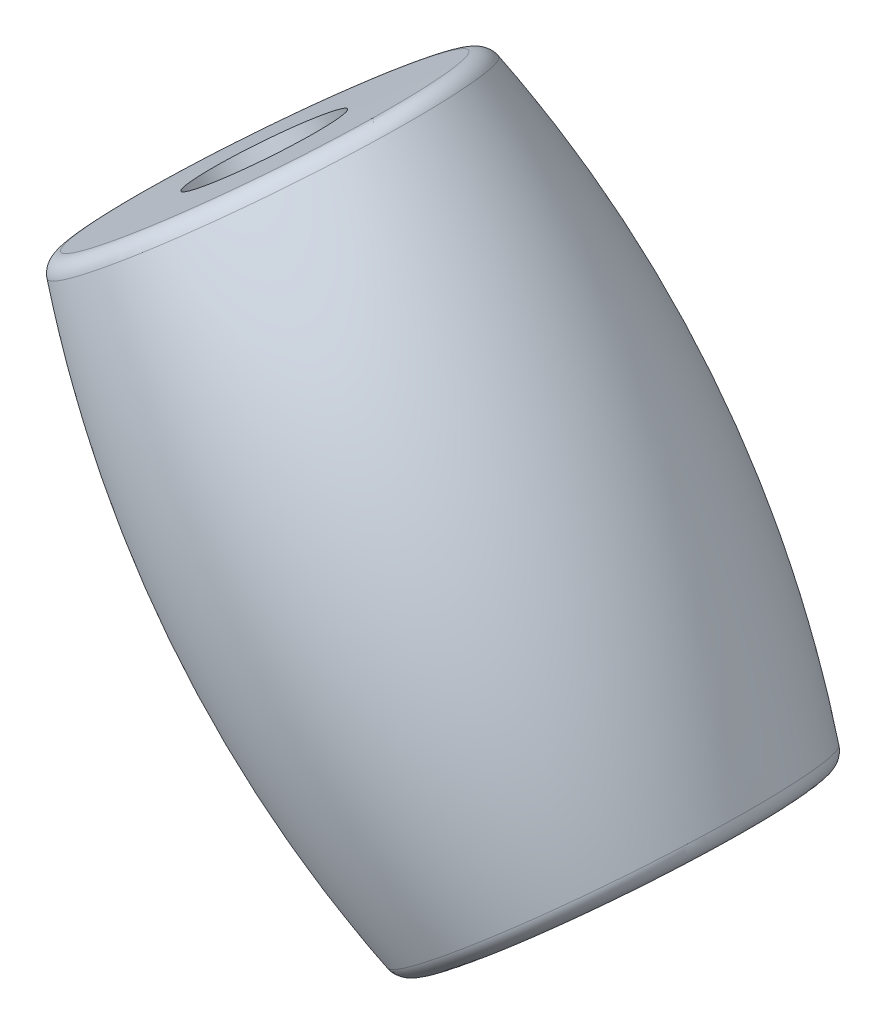
ISO-10303-21;
HEADER;
FILE_DESCRIPTION(('STEP AP214'),'2;1');
FILE_NAME('part.step','',(''),(''),'','','');
FILE_SCHEMA(('AUTOMOTIVE_DESIGN { 1 0 10303 214 1 1 1 1 }'));
ENDSEC;
DATA;
#1=APPLICATION_CONTEXT('core data for automotive mechanical design processes');
#2=APPLICATION_PROTOCOL_DEFINITION('international standard','automotive_design',2000,#1);
#3=PRODUCT_CONTEXT('',#1,'mechanical');
#4=PRODUCT('Part','Part','',(#3));
#5=PRODUCT_RELATED_PRODUCT_CATEGORY('part','',(#4));
#6=PRODUCT_DEFINITION_FORMATION('','',#4);
#7=PRODUCT_DEFINITION_CONTEXT('part definition',#1,'design');
#8=PRODUCT_DEFINITION('design','',#6,#7);
#9=PRODUCT_DEFINITION_SHAPE('','',#8);
#10=(LENGTH_UNIT() NAMED_UNIT(*) SI_UNIT(.MILLI.,.METRE.));
#11=(NAMED_UNIT(*) PLANE_ANGLE_UNIT() SI_UNIT($,.RADIAN.));
#12=(NAMED_UNIT(*) SI_UNIT($,.STERADIAN.) SOLID_ANGLE_UNIT());
#13=UNCERTAINTY_MEASURE_WITH_UNIT(LENGTH_MEASURE(1.E-05),#10,'distance_accuracy_value','');
#14=(GEOMETRIC_REPRESENTATION_CONTEXT(3) GLOBAL_UNCERTAINTY_ASSIGNED_CONTEXT((#13)) GLOBAL_UNIT_ASSIGNED_CONTEXT((#10,
#11,#12)) REPRESENTATION_CONTEXT('',''));
#15=CARTESIAN_POINT('',(0.,0.,0.));
#16=DIRECTION('',(0.,0.,1.));
#17=DIRECTION('',(1.,0.,0.));
#18=AXIS2_PLACEMENT_3D('',#15,#16,#17);
#19=CARTESIAN_POINT('',(18.4522106783066,15.3546709858395,0.));
#20=DIRECTION('',(0.623489801858733,-0.78183148246803,0.));
#21=DIRECTION('',(0.78183148246803,0.623489801858733,0.));
#22=AXIS2_PLACEMENT_3D('',#19,#20,#21);
#23=CONICAL_SURFACE('',#22,4.50000000006009,1.48352986420178);
#24=CARTESIAN_POINT('',(18.4522106783033,15.3546709858436,0.));
#25=DIRECTION('',(-0.623489801858733,0.78183148246803,0.));
#26=DIRECTION('',(-0.78183148246803,-0.623489801858733,0.));
#27=AXIS2_PLACEMENT_3D('',#24,#25,#26);
#28=CIRCLE('',#27,4.5);
#29=CARTESIAN_POINT('',(14.9339690071972,12.5489668774793,0.));
#30=VERTEX_POINT('',#29);
#31=EDGE_CURVE('E21',#30,#30,#28,.F.);
#32=ORIENTED_EDGE('',*,*,#31,.T.);
#33=EDGE_LOOP('',(#32));
#34=FACE_BOUND('',#33,.T.);
#35=CARTESIAN_POINT('',(18.3703882440733,15.457273073099,0.));
#36=DIRECTION('',(-0.623489801858733,0.78183148246803,0.));
#37=DIRECTION('',(-0.78183148246803,-0.623489801858733,0.));
#38=AXIS2_PLACEMENT_3D('',#35,#36,#37);
#39=CIRCLE('',#38,3.);
#40=CARTESIAN_POINT('',(16.0248937966693,13.5868036675228,0.));
#41=VERTEX_POINT('',#40);
#42=EDGE_CURVE('E394',#41,#41,#39,.T.);
#43=ORIENTED_EDGE('',*,*,#42,.T.);
#44=EDGE_LOOP('',(#43));
#45=FACE_BOUND('',#44,.T.);
#46=ADVANCED_FACE('F17',(#34,#45),#23,.F.);
#47=CARTESIAN_POINT('',(18.7639555792327,14.9637552446096,0.));
#48=DIRECTION('',(-0.623489801858733,0.78183148246803,0.));
#49=DIRECTION('',(-0.78183148246803,-0.623489801858733,0.));
#50=AXIS2_PLACEMENT_3D('',#47,#48,#49);
#51=CYLINDRICAL_SURFACE('',#50,4.5);
#52=CARTESIAN_POINT('',(19.0757004801677,14.5728395033685,0.));
#53=DIRECTION('',(-0.623489801858733,0.78183148246803,0.));
#54=DIRECTION('',(-0.486362075895545,-0.387860812888301,-0.782953332553226));
#55=AXIS2_PLACEMENT_3D('',#52,#53,#54);
#56=CIRCLE('',#55,4.50000000002372);
#57=CARTESIAN_POINT('',(16.8870711386262,12.827465845362,-3.52328999650808));
#58=VERTEX_POINT('',#57);
#59=EDGE_CURVE('E392',#58,#58,#56,.F.);
#60=ORIENTED_EDGE('',*,*,#59,.T.);
#61=EDGE_LOOP('',(#60));
#62=FACE_BOUND('',#61,.T.);
#63=ORIENTED_EDGE('',*,*,#31,.F.);
#64=EDGE_LOOP('',(#63));
#65=FACE_BOUND('',#64,.T.);
#66=ADVANCED_FACE('F134',(#62,#65),#51,.F.);
#67=CARTESIAN_POINT('',(17.4858014854223,16.5665097836691,0.));
#68=DIRECTION('',(-0.623489801858733,0.78183148246803,0.));
#69=DIRECTION('',(-0.78183148246803,-0.623489801858733,0.));
#70=AXIS2_PLACEMENT_3D('',#67,#68,#69);
#71=CYLINDRICAL_SURFACE('',#70,3.);
#72=ORIENTED_EDGE('',*,*,#42,.F.);
#73=EDGE_LOOP('',(#72));
#74=FACE_BOUND('',#73,.T.);
#75=CARTESIAN_POINT('',(16.6012147267657,17.675746494246,0.));
#76=DIRECTION('',(-0.623489801858733,0.78183148246803,0.));
#77=DIRECTION('',(-0.486362075899316,-0.387860812891308,-0.782953332549394));
#78=AXIS2_PLACEMENT_3D('',#75,#76,#77);
#79=CIRCLE('',#78,3.0000000000063);
#80=CARTESIAN_POINT('',(15.1421284990647,16.5121640555697,-2.34885999765311));
#81=VERTEX_POINT('',#80);
#82=EDGE_CURVE('E389',#81,#81,#79,.T.);
#83=ORIENTED_EDGE('',*,*,#82,.T.);
#84=EDGE_LOOP('',(#83));
#85=FACE_BOUND('',#84,.T.);
#86=ADVANCED_FACE('F130',(#74,#85),#71,.F.);
#87=CARTESIAN_POINT('',(19.0757004801677,14.5728395033685,0.));
#88=DIRECTION('',(-0.623489801858733,0.78183148246803,0.));
#89=DIRECTION('',(-0.78183148246803,-0.623489801858733,0.));
#90=AXIS2_PLACEMENT_3D('',#87,#88,#89);
#91=CONICAL_SURFACE('',#90,4.50000000002372,1.48352986419037);
#92=ORIENTED_EDGE('',*,*,#59,.F.);
#93=EDGE_LOOP('',(#92));
#94=FACE_BOUND('',#93,.T.);
#95=CARTESIAN_POINT('',(19.1575229143921,14.4702374161202,0.));
#96=DIRECTION('',(-0.623489801858733,0.78183148246803,0.));
#97=DIRECTION('',(-0.78183148246803,-0.623489801858733,0.));
#98=AXIS2_PLACEMENT_3D('',#95,#96,#97);
#99=CIRCLE('',#98,3.);
#100=CARTESIAN_POINT('',(16.812028466988,12.599768010544,0.));
#101=VERTEX_POINT('',#100);
#102=EDGE_CURVE('E386',#101,#101,#99,.F.);
#103=ORIENTED_EDGE('',*,*,#102,.T.);
#104=EDGE_LOOP('',(#103));
#105=FACE_BOUND('',#104,.T.);
#106=ADVANCED_FACE('F126',(#94,#105),#91,.F.);
#107=CARTESIAN_POINT('',(16.5193922925613,17.7783485814694,0.));
#108=DIRECTION('',(-0.623489801858733,0.78183148246803,0.));
#109=DIRECTION('',(-0.78183148246803,-0.623489801858733,0.));
#110=AXIS2_PLACEMENT_3D('',#107,#108,#109);
#111=CONICAL_SURFACE('',#110,4.49999999987882,1.48352986420313);
#112=CARTESIAN_POINT('',(16.5193922925413,17.7783485814945,0.));
#113=DIRECTION('',(-0.623489801858733,0.78183148246803,0.));
#114=DIRECTION('',(-0.78183148246803,-0.623489801858733,0.));
#115=AXIS2_PLACEMENT_3D('',#112,#113,#114);
#116=CIRCLE('',#115,4.5);
#117=CARTESIAN_POINT('',(13.0011506214351,14.9726444731302,0.));
#118=VERTEX_POINT('',#117);
#119=EDGE_CURVE('E383',#118,#118,#116,.T.);
#120=ORIENTED_EDGE('',*,*,#119,.T.);
#121=EDGE_LOOP('',(#120));
#122=FACE_BOUND('',#121,.T.);
#123=ORIENTED_EDGE('',*,*,#82,.F.);
#124=EDGE_LOOP('',(#123));
#125=FACE_BOUND('',#124,.T.);
#126=ADVANCED_FACE('F122',(#122,#125),#111,.F.);
#127=CARTESIAN_POINT('',(20.0421096730431,13.3610007055501,0.));
#128=DIRECTION('',(-0.623489801858733,0.78183148246803,0.));
#129=DIRECTION('',(-0.78183148246803,-0.623489801858733,0.));
#130=AXIS2_PLACEMENT_3D('',#127,#128,#129);
#131=CYLINDRICAL_SURFACE('',#130,3.);
#132=ORIENTED_EDGE('',*,*,#102,.F.);
#133=EDGE_LOOP('',(#132));
#134=FACE_BOUND('',#133,.T.);
#135=CARTESIAN_POINT('',(20.9266964317004,12.2517639949723,0.));
#136=DIRECTION('',(0.623489801858733,-0.78183148246803,0.));
#137=DIRECTION('',(0.486362075898729,0.38786081289084,0.78295333254999));
#138=AXIS2_PLACEMENT_3D('',#135,#136,#137);
#139=CIRCLE('',#138,3.000000000004);
#140=CARTESIAN_POINT('',(22.3857826593985,13.4153464336464,2.34885999765311));
#141=VERTEX_POINT('',#140);
#142=EDGE_CURVE('E380',#141,#141,#139,.T.);
#143=ORIENTED_EDGE('',*,*,#142,.T.);
#144=EDGE_LOOP('',(#143));
#145=FACE_BOUND('',#144,.T.);
#146=ADVANCED_FACE('F118',(#134,#145),#131,.F.);
#147=CARTESIAN_POINT('',(16.2076473916119,18.1692643227285,0.));
#148=DIRECTION('',(-0.623489801858733,0.78183148246803,0.));
#149=DIRECTION('',(-0.78183148246803,-0.623489801858733,0.));
#150=AXIS2_PLACEMENT_3D('',#147,#148,#149);
#151=CYLINDRICAL_SURFACE('',#150,4.5);
#152=CARTESIAN_POINT('',(15.8959024906755,18.5601800639713,0.));
#153=DIRECTION('',(0.623489801858733,-0.78183148246803,0.));
#154=DIRECTION('',(0.486362075891481,0.38786081288506,0.782953332557356));
#155=AXIS2_PLACEMENT_3D('',#152,#153,#154);
#156=CIRCLE('',#155,4.49999999999997);
#157=CARTESIAN_POINT('',(18.0845318321872,20.3055537219541,3.52328999650808));
#158=VERTEX_POINT('',#157);
#159=EDGE_CURVE('E377',#158,#158,#156,.F.);
#160=ORIENTED_EDGE('',*,*,#159,.T.);
#161=EDGE_LOOP('',(#160));
#162=FACE_BOUND('',#161,.T.);
#163=ORIENTED_EDGE('',*,*,#119,.F.);
#164=EDGE_LOOP('',(#163));
#165=FACE_BOUND('',#164,.T.);
#166=ADVANCED_FACE('F114',(#162,#165),#151,.F.);
#167=CARTESIAN_POINT('',(21.008518865913,12.1491619077386,0.));
#168=DIRECTION('',(0.623489801858733,-0.78183148246803,0.));
#169=DIRECTION('',(0.78183148246803,0.623489801858733,0.));
#170=AXIS2_PLACEMENT_3D('',#167,#168,#169);
#171=CONICAL_SURFACE('',#170,4.50000000000421,1.48352986422498);
#172=ORIENTED_EDGE('',*,*,#142,.F.);
#173=EDGE_LOOP('',(#172));
#174=FACE_BOUND('',#173,.T.);
#175=CARTESIAN_POINT('',(21.0085188659241,12.1491619077247,0.));
#176=DIRECTION('',(-0.623489801858733,0.78183148246803,0.));
#177=DIRECTION('',(-0.78183148246803,-0.623489801858733,0.));
#178=AXIS2_PLACEMENT_3D('',#175,#176,#177);
#179=CIRCLE('',#178,4.5);
#180=CARTESIAN_POINT('',(17.490277194818,9.34345779936039,0.));
#181=VERTEX_POINT('',#180);
#182=EDGE_CURVE('E374',#181,#181,#179,.F.);
#183=ORIENTED_EDGE('',*,*,#182,.T.);
#184=EDGE_LOOP('',(#183));
#185=FACE_BOUND('',#184,.T.);
#186=ADVANCED_FACE('F110',(#174,#185),#171,.F.);
#187=CARTESIAN_POINT('',(15.8959024906673,18.5601800639817,0.));
#188=DIRECTION('',(0.623489801858733,-0.78183148246803,0.));
#189=DIRECTION('',(0.78183148246803,0.623489801858733,0.));
#190=AXIS2_PLACEMENT_3D('',#187,#188,#189);
#191=CONICAL_SURFACE('',#190,4.49999999987229,1.4835298642079);
#192=ORIENTED_EDGE('',*,*,#159,.F.);
#193=EDGE_LOOP('',(#192));
#194=FACE_BOUND('',#193,.T.);
#195=CARTESIAN_POINT('',(15.8140800564525,18.662782151218,0.));
#196=DIRECTION('',(-0.623489801858733,0.78183148246803,0.));
#197=DIRECTION('',(-0.78183148246803,-0.623489801858733,0.));
#198=AXIS2_PLACEMENT_3D('',#195,#196,#197);
#199=CIRCLE('',#198,3.);
#200=CARTESIAN_POINT('',(13.4685856090484,16.7923127456418,0.));
#201=VERTEX_POINT('',#200);
#202=EDGE_CURVE('E371',#201,#201,#199,.T.);
#203=ORIENTED_EDGE('',*,*,#202,.T.);
#204=EDGE_LOOP('',(#203));
#205=FACE_BOUND('',#204,.T.);
#206=ADVANCED_FACE('F106',(#194,#205),#191,.F.);
#207=CARTESIAN_POINT('',(21.3202637668535,11.7582461664907,0.));
#208=DIRECTION('',(-0.623489801858733,0.78183148246803,0.));
#209=DIRECTION('',(-0.78183148246803,-0.623489801858733,0.));
#210=AXIS2_PLACEMENT_3D('',#207,#208,#209);
#211=CYLINDRICAL_SURFACE('',#210,4.5);
#212=CARTESIAN_POINT('',(21.6320086677906,11.367330425247,0.));
#213=DIRECTION('',(-0.623489801858733,0.78183148246803,0.));
#214=DIRECTION('',(-0.486362075891871,-0.387860812885371,-0.782953332556959));
#215=AXIS2_PLACEMENT_3D('',#212,#213,#214);
#216=CIRCLE('',#215,4.50000000000226);
#217=CARTESIAN_POINT('',(19.443379326276,9.62195676726196,-3.52328999650808));
#218=VERTEX_POINT('',#217);
#219=EDGE_CURVE('E368',#218,#218,#216,.F.);
#220=ORIENTED_EDGE('',*,*,#219,.T.);
#221=EDGE_LOOP('',(#220));
#222=FACE_BOUND('',#221,.T.);
#223=ORIENTED_EDGE('',*,*,#182,.F.);
#224=EDGE_LOOP('',(#223));
#225=FACE_BOUND('',#224,.T.);
#226=ADVANCED_FACE('F102',(#222,#225),#211,.F.);
#227=CARTESIAN_POINT('',(15.3637952100659,19.2274214892373,0.));
#228=DIRECTION('',(-0.623489801858733,0.78183148246803,0.));
#229=DIRECTION('',(-0.78183148246803,-0.623489801858733,0.));
#230=AXIS2_PLACEMENT_3D('',#227,#228,#229);
#231=CYLINDRICAL_SURFACE('',#230,3.);
#232=ORIENTED_EDGE('',*,*,#202,.F.);
#233=EDGE_LOOP('',(#232));
#234=FACE_BOUND('',#233,.T.);
#235=CARTESIAN_POINT('',(14.9135103637041,19.7920608272256,0.));
#236=DIRECTION('',(-0.623489801858733,0.78183148246803,0.));
#237=DIRECTION('',(-0.486362075888253,-0.387860812882486,-0.782953332560636));
#238=AXIS2_PLACEMENT_3D('',#235,#236,#237);
#239=CIRCLE('',#238,2.99999999996322);
#240=CARTESIAN_POINT('',(13.4544241360572,18.6284783885924,-2.34885999765311));
#241=VERTEX_POINT('',#240);
#242=EDGE_CURVE('E365',#241,#241,#239,.T.);
#243=ORIENTED_EDGE('',*,*,#242,.T.);
#244=EDGE_LOOP('',(#243));
#245=FACE_BOUND('',#244,.T.);
#246=ADVANCED_FACE('F98',(#234,#245),#231,.F.);
#247=CARTESIAN_POINT('',(21.6320086677906,11.367330425247,0.));
#248=DIRECTION('',(-0.623489801858733,0.78183148246803,0.));
#249=DIRECTION('',(-0.78183148246803,-0.623489801858733,0.));
#250=AXIS2_PLACEMENT_3D('',#247,#248,#249);
#251=CONICAL_SURFACE('',#250,4.50000000000226,1.48352986422498);
#252=ORIENTED_EDGE('',*,*,#219,.F.);
#253=EDGE_LOOP('',(#252));
#254=FACE_BOUND('',#253,.T.);
#255=CARTESIAN_POINT('',(21.7138311020129,11.2647283380012,0.));
#256=DIRECTION('',(-0.623489801858733,0.78183148246803,0.));
#257=DIRECTION('',(-0.78183148246803,-0.623489801858733,0.));
#258=AXIS2_PLACEMENT_3D('',#255,#256,#257);
#259=CIRCLE('',#258,3.);
#260=CARTESIAN_POINT('',(19.3683366546088,9.39425893242503,0.));
#261=VERTEX_POINT('',#260);
#262=EDGE_CURVE('E360',#261,#261,#259,.F.);
#263=ORIENTED_EDGE('',*,*,#262,.T.);
#264=EDGE_LOOP('',(#263));
#265=FACE_BOUND('',#264,.T.);
#266=ADVANCED_FACE('F94',(#254,#265),#251,.F.);
#267=CARTESIAN_POINT('',(14.8671443176334,19.8502020100125,0.));
#268=DIRECTION('',(-0.623489801858733,0.78183148246803,0.));
#269=DIRECTION('',(-0.78183148246803,-0.623489801858733,0.));
#270=AXIS2_PLACEMENT_3D('',#267,#268,#269);
#271=CONICAL_SURFACE('',#270,3.85000000005626,1.4835298641821);
#272=CARTESIAN_POINT('',(14.8671443176156,19.8502020100348,0.));
#273=DIRECTION('',(-0.623489801858733,0.78183148246803,0.));
#274=DIRECTION('',(-0.78183148246803,-0.623489801858733,0.));
#275=AXIS2_PLACEMENT_3D('',#272,#273,#274);
#276=CIRCLE('',#275,3.85);
#277=CARTESIAN_POINT('',(11.8570931101137,17.4497662728787,0.));
#278=VERTEX_POINT('',#277);
#279=EDGE_CURVE('E357',#278,#278,#276,.T.);
#280=ORIENTED_EDGE('',*,*,#279,.T.);
#281=EDGE_LOOP('',(#280));
#282=FACE_BOUND('',#281,.T.);
#283=ORIENTED_EDGE('',*,*,#242,.F.);
#284=EDGE_LOOP('',(#283));
#285=FACE_BOUND('',#284,.T.);
#286=ADVANCED_FACE('F90',(#282,#285),#271,.F.);
#287=CARTESIAN_POINT('',(22.1641159483995,10.7000889999819,0.));
#288=DIRECTION('',(-0.623489801858733,0.78183148246803,0.));
#289=DIRECTION('',(-0.78183148246803,-0.623489801858733,0.));
#290=AXIS2_PLACEMENT_3D('',#287,#288,#289);
#291=CYLINDRICAL_SURFACE('',#290,3.);
#292=ORIENTED_EDGE('',*,*,#262,.F.);
#293=EDGE_LOOP('',(#292));
#294=FACE_BOUND('',#293,.T.);
#295=CARTESIAN_POINT('',(22.6144007947841,10.1354496619651,0.));
#296=DIRECTION('',(0.623489801858733,-0.78183148246803,0.));
#297=DIRECTION('',(0.486362075901981,0.387860812893434,0.782953332546685));
#298=AXIS2_PLACEMENT_3D('',#295,#296,#297);
#299=CIRCLE('',#298,2.99999999994406);
#300=CARTESIAN_POINT('',(24.0734870224628,11.2990321006237,2.34885999759626));
#301=VERTEX_POINT('',#300);
#302=EDGE_CURVE('E57',#301,#301,#299,.T.);
#303=ORIENTED_EDGE('',*,*,#302,.T.);
#304=EDGE_LOOP('',(#303));
#305=FACE_BOUND('',#304,.T.);
#306=ADVANCED_FACE('F87',(#294,#305),#291,.F.);
#307=CARTESIAN_POINT('',(14.5779240808966,20.2128727157299,0.));
#308=DIRECTION('',(-0.623489801858733,0.78183148246803,0.));
#309=DIRECTION('',(-0.78183148246803,-0.623489801858733,0.));
#310=AXIS2_PLACEMENT_3D('',#307,#308,#309);
#311=CYLINDRICAL_SURFACE('',#310,3.85);
#312=CARTESIAN_POINT('',(14.2887038441718,20.5755434214322,0.));
#313=DIRECTION('',(0.623489801858733,-0.78183148246803,0.));
#314=DIRECTION('',(0.486362075894909,0.387860812887794,0.782953332553872));
#315=AXIS2_PLACEMENT_3D('',#312,#313,#314);
#316=CIRCLE('',#315,3.85000000000178);
#317=CARTESIAN_POINT('',(16.161197835608,22.0688075504615,3.01437032911111));
#318=VERTEX_POINT('',#317);
#319=CARTESIAN_POINT('',(12.4162098517998,19.0822792916612,-3.0143703306311));
#320=VERTEX_POINT('',#319);
#321=EDGE_CURVE('E47',#318,#320,#316,.F.);
#322=ORIENTED_EDGE('',*,*,#321,.T.);
#323=CARTESIAN_POINT('',(14.2887038441718,20.5755434214322,0.));
#324=DIRECTION('',(0.623489801858733,-0.78183148246803,0.));
#325=DIRECTION('',(0.486362075894909,0.387860812887794,0.782953332553872));
#326=AXIS2_PLACEMENT_3D('',#323,#324,#325);
#327=CIRCLE('',#326,3.85000000000178);
#328=EDGE_CURVE('E42',#320,#318,#327,.F.);
#329=ORIENTED_EDGE('',*,*,#328,.T.);
#330=EDGE_LOOP('',(#322,#329));
#331=FACE_BOUND('',#330,.T.);
#332=ORIENTED_EDGE('',*,*,#279,.F.);
#333=EDGE_LOOP('',(#332));
#334=FACE_BOUND('',#333,.T.);
#335=ADVANCED_FACE('F55',(#331,#334),#311,.F.);
#336=CARTESIAN_POINT('',(22.6607668408522,10.0773084791814,0.));
#337=DIRECTION('',(0.623489801858733,-0.78183148246803,0.));
#338=DIRECTION('',(0.78183148246803,0.623489801858733,0.));
#339=AXIS2_PLACEMENT_3D('',#336,#337,#338);
#340=CONICAL_SURFACE('',#339,3.84999999981522,1.48352986419983);
#341=CARTESIAN_POINT('',(22.6607668408498,10.0773084791844,0.));
#342=DIRECTION('',(-0.623489801858733,0.78183148246803,0.));
#343=DIRECTION('',(-0.78183148246803,-0.623489801858733,0.));
#344=AXIS2_PLACEMENT_3D('',#341,#342,#343);
#345=CIRCLE('',#344,3.85000000000001);
#346=CARTESIAN_POINT('',(19.6507156333479,7.67687274202828,0.));
#347=VERTEX_POINT('',#346);
#348=EDGE_CURVE('E183',#347,#347,#345,.F.);
#349=ORIENTED_EDGE('',*,*,#348,.T.);
#350=EDGE_LOOP('',(#349));
#351=FACE_BOUND('',#350,.T.);
#352=ORIENTED_EDGE('',*,*,#302,.F.);
#353=EDGE_LOOP('',(#352));
#354=FACE_BOUND('',#353,.T.);
#355=ADVANCED_FACE('F81',(#351,#354),#340,.F.);
#356=CARTESIAN_POINT('',(14.2887038441797,20.5755434214223,0.));
#357=DIRECTION('',(0.623489801858733,-0.78183148246803,0.));
#358=DIRECTION('',(0.78183148246803,0.623489801858733,0.));
#359=AXIS2_PLACEMENT_3D('',#356,#357,#358);
#360=CONICAL_SURFACE('',#359,3.85000000066742,1.56206968053958);
#361=DIRECTION('',(0.480902650832176,0.394668724518434,0.782923520089656));
#362=VECTOR('',#361,1.);
#363=CARTESIAN_POINT('',(-306491.306042642,-251523.37212851,-498999.999999856));
#364=LINE('',#363,#362);
#365=CARTESIAN_POINT('',(13.3780517777306,19.8716467976408,-1.44846366505933));
#366=VERTEX_POINT('',#365);
#367=EDGE_CURVE('E52',#320,#366,#364,.T.);
#368=ORIENTED_EDGE('',*,*,#367,.T.);
#369=CARTESIAN_POINT('',(14.2778216180382,20.5891893013892,0.));
#370=DIRECTION('',(-0.623489801858733,0.78183148246803,0.));
#371=DIRECTION('',(-0.78183148246803,-0.623489801858733,0.));
#372=AXIS2_PLACEMENT_3D('',#369,#370,#371);
#373=CIRCLE('',#372,1.85);
#374=CARTESIAN_POINT('',(15.1775914573362,21.3067318043798,1.44846366346772));
#375=VERTEX_POINT('',#374);
#376=EDGE_CURVE('E36',#366,#375,#373,.T.);
#377=ORIENTED_EDGE('',*,*,#376,.T.);
#378=CARTESIAN_POINT('',(15.177591458098,21.306731804998,1.44846366470119));
#379=CARTESIAN_POINT('',(15.2361697942813,21.3521169613334,1.54172069230533));
#380=CARTESIAN_POINT('',(15.2947481305301,21.3975021176868,1.63497771985949));
#381=CARTESIAN_POINT('',(15.3727530471907,21.4579385446514,1.7591619683409));
#382=CARTESIAN_POINT('',(15.3921796276142,21.4729898152553,1.79008918926431));
#383=CARTESIAN_POINT('',(15.4565520886747,21.5228641271512,1.89257049486726));
#384=CARTESIAN_POINT('',(15.5014979692928,21.5576871684454,1.96412457955748));
#385=CARTESIAN_POINT('',(15.5874274490372,21.6242633658257,2.10092477533379));
#386=CARTESIAN_POINT('',(15.6284110481603,21.6560165219133,2.16617088642102));
#387=CARTESIAN_POINT('',(15.7103782463421,21.7195228340913,2.29666310856831));
#388=CARTESIAN_POINT('',(15.7513618454008,21.7512759901816,2.36190921962836));
#389=CARTESIAN_POINT('',(15.8333290435859,21.8147823023639,2.49240144175251));
#390=CARTESIAN_POINT('',(15.8743126427123,21.8465354584559,2.55764755281659));
#391=CARTESIAN_POINT('',(15.9562798409029,21.9100417706227,2.68813977494025));
#392=CARTESIAN_POINT('',(15.9972634399671,21.9417949266974,2.75338588599981));
#393=CARTESIAN_POINT('',(16.0792306381331,22.0053012388656,2.88387810815716));
#394=CARTESIAN_POINT('',(16.1202142372349,22.037054394959,2.94912421925494));
#395=CARTESIAN_POINT('',(16.161197836368,22.0688075510509,3.0143703303338));
#396=B_SPLINE_CURVE_WITH_KNOTS('',3,(#378,#379,#380,#381,#382,#383,#384,#385,#386,#387,#388,
#389,#390,#391,#392,#393,#394,#395),.UNSPECIFIED.,.F.,.F.,(4,2,2,2,2,2,2,2,4),(0.,
0.357341522563884,0.475848197102074,0.750028558959767,1.00003807872959,1.25004759834367,
1.50005711806898,1.75006663767223,2.00007615744205),.UNSPECIFIED.);
#397=EDGE_CURVE('E50',#375,#318,#396,.T.);
#398=ORIENTED_EDGE('',*,*,#397,.T.);
#399=ORIENTED_EDGE('',*,*,#328,.F.);
#400=EDGE_LOOP('',(#368,#377,#398,#399));
#401=FACE_BOUND('',#400,.T.);
#402=ADVANCED_FACE('F59',(#401),#360,.F.);
#403=CARTESIAN_POINT('',(14.2887038441741,20.5755434214293,0.));
#404=DIRECTION('',(0.623489801858733,-0.78183148246803,0.));
#405=DIRECTION('',(0.78183148246803,0.623489801858733,0.));
#406=AXIS2_PLACEMENT_3D('',#403,#404,#405);
#407=CONICAL_SURFACE('',#406,3.85000000080613,1.56206968052776);
#408=CARTESIAN_POINT('',(14.2778216180382,20.5891893013892,0.));
#409=DIRECTION('',(-0.623489801858733,0.78183148246803,0.));
#410=DIRECTION('',(-0.78183148246803,-0.623489801858733,0.));
#411=AXIS2_PLACEMENT_3D('',#408,#409,#410);
#412=CIRCLE('',#411,1.85);
#413=EDGE_CURVE('E181',#375,#366,#412,.T.);
#414=ORIENTED_EDGE('',*,*,#413,.T.);
#415=ORIENTED_EDGE('',*,*,#367,.F.);
#416=ORIENTED_EDGE('',*,*,#321,.F.);
#417=ORIENTED_EDGE('',*,*,#397,.F.);
#418=EDGE_LOOP('',(#414,#415,#416,#417));
#419=FACE_BOUND('',#418,.T.);
#420=ADVANCED_FACE('F49',(#419),#407,.F.);
#421=CARTESIAN_POINT('',(23.1751459273832,9.43229750614829,0.));
#422=DIRECTION('',(-0.623489801858733,0.78183148246803,0.));
#423=DIRECTION('',(-0.78183148246803,-0.623489801858733,0.));
#424=AXIS2_PLACEMENT_3D('',#421,#422,#423);
#425=CYLINDRICAL_SURFACE('',#424,3.85000000000001);
#426=ORIENTED_EDGE('',*,*,#348,.F.);
#427=EDGE_LOOP('',(#426));
#428=FACE_BOUND('',#427,.T.);
#429=CARTESIAN_POINT('',(23.689525013916,8.78728653311306,0.));
#430=DIRECTION('',(-0.623489801858733,0.78183148246803,0.));
#431=DIRECTION('',(-0.486362075899522,-0.387860812891472,-0.782953332549185));
#432=AXIS2_PLACEMENT_3D('',#429,#430,#431);
#433=CIRCLE('',#432,3.84999999995224);
#434=CARTESIAN_POINT('',(21.8170310217261,7.29402240349941,-3.01437033027696));
#435=VERTEX_POINT('',#434);
#436=EDGE_CURVE('E178',#435,#435,#433,.T.);
#437=ORIENTED_EDGE('',*,*,#436,.F.);
#438=EDGE_LOOP('',(#437));
#439=FACE_BOUND('',#438,.T.);
#440=ADVANCED_FACE('F75',(#428,#439),#425,.F.);
#441=CARTESIAN_POINT('',(13.9660767171088,20.9801050426233,0.));
#442=DIRECTION('',(-0.623489801858733,0.78183148246803,0.));
#443=DIRECTION('',(-0.78183148246803,-0.623489801858733,0.));
#444=AXIS2_PLACEMENT_3D('',#441,#442,#443);
#445=CYLINDRICAL_SURFACE('',#444,1.85);
#446=ORIENTED_EDGE('',*,*,#376,.F.);
#447=ORIENTED_EDGE('',*,*,#413,.F.);
#448=EDGE_LOOP('',(#446,#447));
#449=FACE_BOUND('',#448,.T.);
#450=CARTESIAN_POINT('',(13.6543318161817,21.3710207838545,0.));
#451=DIRECTION('',(0.623489801858733,-0.78183148246803,0.));
#452=DIRECTION('',(0.486362075896867,0.387860812889355,0.782953332551882));
#453=AXIS2_PLACEMENT_3D('',#450,#451,#452);
#454=CIRCLE('',#453,1.84999999998952);
#455=CARTESIAN_POINT('',(14.5541016565858,22.0885632876957,1.44846366521278));
#456=VERTEX_POINT('',#455);
#457=EDGE_CURVE('E175',#456,#456,#454,.T.);
#458=ORIENTED_EDGE('',*,*,#457,.F.);
#459=EDGE_LOOP('',(#458));
#460=FACE_BOUND('',#459,.T.);
#461=ADVANCED_FACE('F190',(#449,#460),#445,.F.);
#462=CARTESIAN_POINT('',(23.6858448849372,8.79190126888995,0.));
#463=DIRECTION('',(-0.623489801858733,0.78183148246803,0.));
#464=DIRECTION('',(-0.78183148246803,-0.623489801858733,0.));
#465=AXIS2_PLACEMENT_3D('',#462,#463,#464);
#466=CONICAL_SURFACE('',#465,4.52635591339024,1.5620696805861);
#467=CARTESIAN_POINT('',(23.6858448849164,8.79190126891595,0.));
#468=DIRECTION('',(-0.623489801858733,0.78183148246803,0.));
#469=DIRECTION('',(-0.48636207589513,-0.38786081288797,-0.782953332553647));
#470=AXIS2_PLACEMENT_3D('',#467,#468,#469);
#471=CIRCLE('',#470,4.52635591341364);
#472=CARTESIAN_POINT('',(21.4843970266284,7.03630518491907,-3.54392544673111));
#473=VERTEX_POINT('',#472);
#474=EDGE_CURVE('E172',#473,#473,#471,.T.);
#475=ORIENTED_EDGE('',*,*,#474,.F.);
#476=EDGE_LOOP('',(#475));
#477=FACE_BOUND('',#476,.T.);
#478=ORIENTED_EDGE('',*,*,#436,.T.);
#479=EDGE_LOOP('',(#478));
#480=FACE_BOUND('',#479,.T.);
#481=ADVANCED_FACE('F152',(#477,#480),#466,.T.);
#482=CARTESIAN_POINT('',(13.6688941713258,21.3527601680808,0.));
#483=DIRECTION('',(0.623489801858733,-0.78183148246803,0.));
#484=DIRECTION('',(0.78183148246803,0.623489801858733,0.));
#485=AXIS2_PLACEMENT_3D('',#482,#483,#484);
#486=CONICAL_SURFACE('',#485,4.52635591382051,1.56206968054516);
#487=CARTESIAN_POINT('',(13.6688941713221,21.3527601680854,0.));
#488=DIRECTION('',(0.623489801858733,-0.78183148246803,0.));
#489=DIRECTION('',(-0.486362075895131,-0.387860812887971,-0.782953332553647));
#490=AXIS2_PLACEMENT_3D('',#487,#488,#489);
#491=CIRCLE('',#490,4.52635591396746);
#492=CARTESIAN_POINT('',(11.4674463127647,19.5971640838737,-3.54392544716473));
#493=VERTEX_POINT('',#492);
#494=EDGE_CURVE('E169',#493,#493,#491,.T.);
#495=ORIENTED_EDGE('',*,*,#494,.F.);
#496=EDGE_LOOP('',(#495));
#497=FACE_BOUND('',#496,.T.);
#498=ORIENTED_EDGE('',*,*,#457,.T.);
#499=EDGE_LOOP('',(#498));
#500=FACE_BOUND('',#499,.T.);
#501=ADVANCED_FACE('F143',(#497,#500),#486,.T.);
#502=CARTESIAN_POINT('',(23.3741118542784,9.1828021252754,0.));
#503=DIRECTION('',(-0.623489801858734,0.78183148246803,0.));
#504=DIRECTION('',(-0.78183148246803,-0.623489801858734,0.));
#505=AXIS2_PLACEMENT_3D('',#502,#503,#504);
#506=TOROIDAL_SURFACE('',#505,4.521992645522,0.499999999999997);
#507=CARTESIAN_POINT('',(23.4537176564167,9.08297960674612,0.));
#508=DIRECTION('',(-0.623489801858733,0.78183148246803,0.));
#509=DIRECTION('',(-0.486362075895131,-0.38786081288797,-0.782953332553647));
#510=AXIS2_PLACEMENT_3D('',#507,#508,#509);
#511=CIRCLE('',#510,5.0054162496834);
#512=CARTESIAN_POINT('',(21.0192730185015,7.14157479130126,-3.91900733350779));
#513=VERTEX_POINT('',#512);
#514=EDGE_CURVE('E27',#513,#513,#511,.T.);
#515=ORIENTED_EDGE('',*,*,#514,.F.);
#516=EDGE_LOOP('',(#515));
#517=FACE_BOUND('',#516,.T.);
#518=ORIENTED_EDGE('',*,*,#474,.T.);
#519=EDGE_LOOP('',(#518));
#520=FACE_BOUND('',#519,.T.);
#521=ADVANCED_FACE('F141',(#517,#520),#506,.T.);
#522=CARTESIAN_POINT('',(13.9806272019571,20.9618593117297,0.));
#523=DIRECTION('',(-0.623489801858733,0.78183148246803,0.));
#524=DIRECTION('',(-0.78183148246803,-0.623489801858733,0.));
#525=AXIS2_PLACEMENT_3D('',#522,#523,#524);
#526=TOROIDAL_SURFACE('',#525,4.521992645522,0.5);
#527=ORIENTED_EDGE('',*,*,#494,.T.);
#528=EDGE_LOOP('',(#527));
#529=FACE_BOUND('',#528,.T.);
#530=CARTESIAN_POINT('',(13.9010213998188,21.061681830259,0.));
#531=DIRECTION('',(-0.623489801858733,0.78183148246803,0.));
#532=DIRECTION('',(-0.486362075895131,-0.387860812887971,-0.782953332553647));
#533=AXIS2_PLACEMENT_3D('',#530,#531,#532);
#534=CIRCLE('',#533,5.0054162496834);
#535=CARTESIAN_POINT('',(11.4665767619035,19.1202770148141,-3.91900733350779));
#536=VERTEX_POINT('',#535);
#537=EDGE_CURVE('E11',#536,#536,#534,.F.);
#538=ORIENTED_EDGE('',*,*,#537,.F.);
#539=EDGE_LOOP('',(#538));
#540=FACE_BOUND('',#539,.T.);
#541=ADVANCED_FACE('F19',(#529,#540),#526,.T.);
#542=CARTESIAN_POINT('',(30.350059349601,24.3809902278139,18.7908799812876));
#543=DIRECTION('',(-0.612137564693703,-0.488163418178508,0.622080444189607));
#544=DIRECTION('',(-0.486362075895131,-0.387860812887971,-0.782953332553647));
#545=AXIS2_PLACEMENT_3D('',#542,#543,#544);
#546=CIRCLE('',#545,30.0000000000002);
#547=TRIMMED_CURVE('',#546,(PARAMETER_VALUE(-0.643501108793283)),
(PARAMETER_VALUE(0.643501108793283)),.T.,.PARAMETER.);
#548=CARTESIAN_POINT('',(18.6773695281178,15.0723307185026,0.));
#549=DIRECTION('',(-0.623489801858733,0.78183148246803,0.));
#550=AXIS1_PLACEMENT('',#548,#549);
#551=SURFACE_OF_REVOLUTION('',#547,#550);
#552=ORIENTED_EDGE('',*,*,#537,.T.);
#553=EDGE_LOOP('',(#552));
#554=FACE_BOUND('',#553,.T.);
#555=ORIENTED_EDGE('',*,*,#514,.T.);
#556=EDGE_LOOP('',(#555));
#557=FACE_BOUND('',#556,.T.);
#558=ADVANCED_FACE('F150',(#554,#557),#551,.F.);
#559=CLOSED_SHELL('',(#46,#66,#86,#106,#126,#146,#166,#186,#206,#226,#246,#266,#286,#306,#335,
#355,#402,#420,#440,#461,#481,#501,#521,#541,#558));
#560=MANIFOLD_SOLID_BREP('B1',#559);
#561=ADVANCED_BREP_SHAPE_REPRESENTATION('',(#18,#560),#14);
#562=SHAPE_DEFINITION_REPRESENTATION(#9,#561);
ENDSEC;
END-ISO-10303-21;
